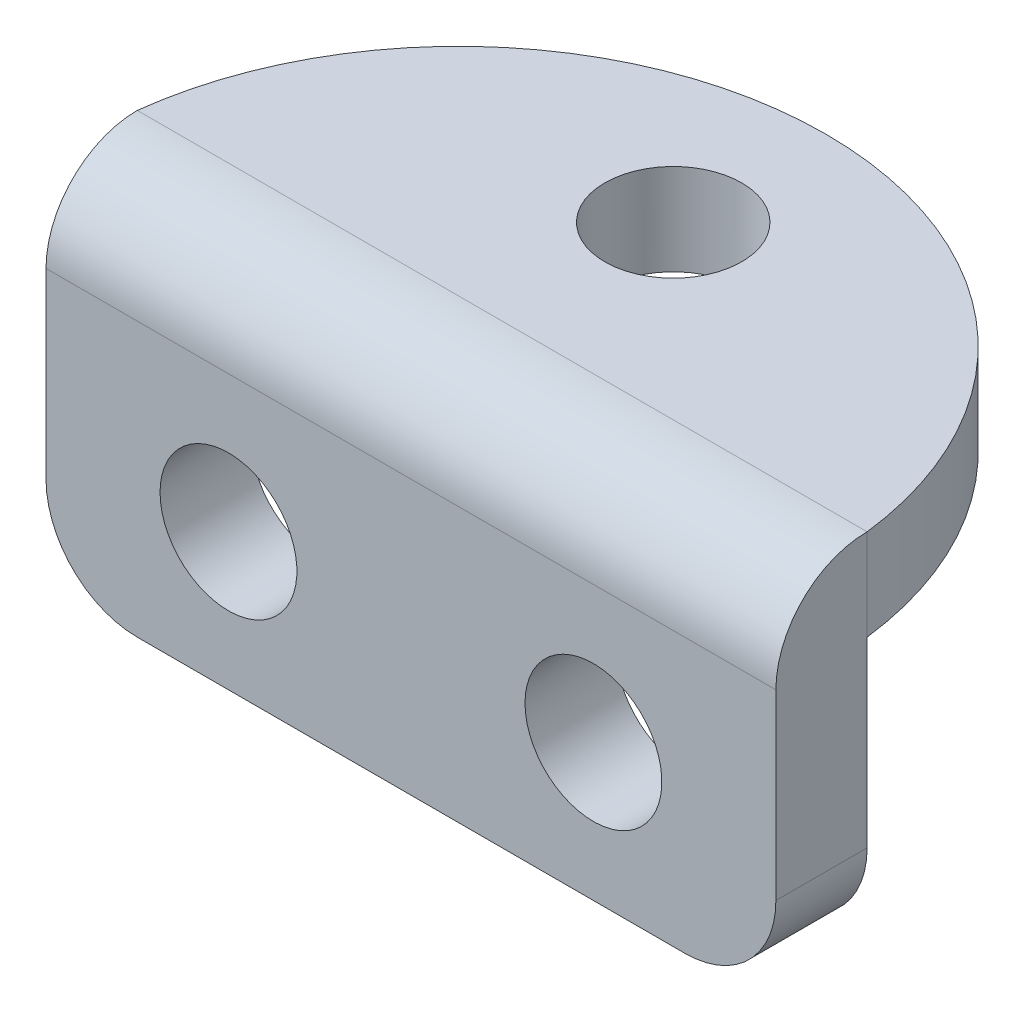
ISO-10303-21;
HEADER;
FILE_DESCRIPTION(('STEP AP214'),'2;1');
FILE_NAME('part.step','',(''),(''),'','','');
FILE_SCHEMA(('AUTOMOTIVE_DESIGN { 1 0 10303 214 1 1 1 1 }'));
ENDSEC;
DATA;
#1=APPLICATION_CONTEXT('core data for automotive mechanical design processes');
#2=APPLICATION_PROTOCOL_DEFINITION('international standard','automotive_design',2000,#1);
#3=PRODUCT_CONTEXT('',#1,'mechanical');
#4=PRODUCT('Part','Part','',(#3));
#5=PRODUCT_RELATED_PRODUCT_CATEGORY('part','',(#4));
#6=PRODUCT_DEFINITION_FORMATION('','',#4);
#7=PRODUCT_DEFINITION_CONTEXT('part definition',#1,'design');
#8=PRODUCT_DEFINITION('design','',#6,#7);
#9=PRODUCT_DEFINITION_SHAPE('','',#8);
#10=(LENGTH_UNIT() NAMED_UNIT(*) SI_UNIT(.MILLI.,.METRE.));
#11=(NAMED_UNIT(*) PLANE_ANGLE_UNIT() SI_UNIT($,.RADIAN.));
#12=(NAMED_UNIT(*) SI_UNIT($,.STERADIAN.) SOLID_ANGLE_UNIT());
#13=UNCERTAINTY_MEASURE_WITH_UNIT(LENGTH_MEASURE(1.E-05),#10,'distance_accuracy_value','');
#14=(GEOMETRIC_REPRESENTATION_CONTEXT(3) GLOBAL_UNCERTAINTY_ASSIGNED_CONTEXT((#13)) GLOBAL_UNIT_ASSIGNED_CONTEXT((#10,
#11,#12)) REPRESENTATION_CONTEXT('',''));
#15=CARTESIAN_POINT('',(0.,0.,0.));
#16=DIRECTION('',(0.,0.,1.));
#17=DIRECTION('',(1.,0.,0.));
#18=AXIS2_PLACEMENT_3D('',#15,#16,#17);
#19=CARTESIAN_POINT('',(8.,2.,0.959848869791568));
#20=DIRECTION('',(0.,-1.,0.));
#21=DIRECTION('',(1.,0.,0.));
#22=AXIS2_PLACEMENT_3D('',#19,#20,#21);
#23=CYLINDRICAL_SURFACE('',#22,8.05737611464428);
#24=CARTESIAN_POINT('',(8.,0.,0.959848869791568));
#25=DIRECTION('',(0.,1.,0.));
#26=DIRECTION('',(1.,0.,0.));
#27=AXIS2_PLACEMENT_3D('',#24,#25,#26);
#28=CIRCLE('',#27,8.05737611464428);
#29=CARTESIAN_POINT('',(16.,0.,0.));
#30=VERTEX_POINT('',#29);
#31=CARTESIAN_POINT('',(0.,0.,0.));
#32=VERTEX_POINT('',#31);
#33=EDGE_CURVE('E77',#30,#32,#28,.T.);
#34=ORIENTED_EDGE('',*,*,#33,.T.);
#35=DIRECTION('',(0.,-1.,0.));
#36=VECTOR('',#35,1.);
#37=CARTESIAN_POINT('',(0.,2.,0.));
#38=LINE('',#37,#36);
#39=CARTESIAN_POINT('',(0.,2.,0.));
#40=VERTEX_POINT('',#39);
#41=EDGE_CURVE('E12',#40,#32,#38,.T.);
#42=ORIENTED_EDGE('',*,*,#41,.F.);
#43=CARTESIAN_POINT('',(8.,2.,0.959848869791568));
#44=DIRECTION('',(0.,1.,0.));
#45=DIRECTION('',(1.,0.,0.));
#46=AXIS2_PLACEMENT_3D('',#43,#44,#45);
#47=CIRCLE('',#46,8.05737611464428);
#48=CARTESIAN_POINT('',(16.,2.,0.));
#49=VERTEX_POINT('',#48);
#50=EDGE_CURVE('E76',#49,#40,#47,.T.);
#51=ORIENTED_EDGE('',*,*,#50,.F.);
#52=DIRECTION('',(0.,-1.,0.));
#53=VECTOR('',#52,1.);
#54=CARTESIAN_POINT('',(16.,2.,0.));
#55=LINE('',#54,#53);
#56=EDGE_CURVE('E54',#49,#30,#55,.T.);
#57=ORIENTED_EDGE('',*,*,#56,.T.);
#58=EDGE_LOOP('',(#34,#42,#51,#57));
#59=FACE_BOUND('',#58,.T.);
#60=ADVANCED_FACE('F45',(#59),#23,.T.);
#61=CARTESIAN_POINT('',(0.,2.,0.));
#62=DIRECTION('',(0.,0.,-1.));
#63=DIRECTION('',(-1.,0.,0.));
#64=AXIS2_PLACEMENT_3D('',#61,#62,#63);
#65=PLANE('',#64);
#66=DIRECTION('',(1.,0.,0.));
#67=VECTOR('',#66,1.);
#68=CARTESIAN_POINT('',(0.,0.,0.));
#69=LINE('',#68,#67);
#70=EDGE_CURVE('E69',#32,#30,#69,.T.);
#71=ORIENTED_EDGE('',*,*,#70,.T.);
#72=ORIENTED_EDGE('',*,*,#56,.F.);
#73=DIRECTION('',(1.,0.,0.));
#74=VECTOR('',#73,1.);
#75=CARTESIAN_POINT('',(0.,2.,0.));
#76=LINE('',#75,#74);
#77=EDGE_CURVE('E61',#40,#49,#76,.T.);
#78=ORIENTED_EDGE('',*,*,#77,.F.);
#79=ORIENTED_EDGE('',*,*,#41,.T.);
#80=EDGE_LOOP('',(#71,#72,#78,#79));
#81=FACE_BOUND('',#80,.T.);
#82=ADVANCED_FACE('F72',(#81),#65,.F.);
#83=CARTESIAN_POINT('',(8.,2.,0.959848869791568));
#84=DIRECTION('',(0.,-1.,0.));
#85=DIRECTION('',(1.,0.,0.));
#86=AXIS2_PLACEMENT_3D('',#83,#84,#85);
#87=PLANE('',#86);
#88=CARTESIAN_POINT('',(8.,2.,-3.75));
#89=DIRECTION('',(0.,1.,0.));
#90=DIRECTION('',(-1.,0.,0.));
#91=AXIS2_PLACEMENT_3D('',#88,#89,#90);
#92=CIRCLE('',#91,1.5);
#93=CARTESIAN_POINT('',(6.5,2.,-3.75));
#94=VERTEX_POINT('',#93);
#95=EDGE_CURVE('E84',#94,#94,#92,.T.);
#96=ORIENTED_EDGE('',*,*,#95,.F.);
#97=EDGE_LOOP('',(#96));
#98=FACE_BOUND('',#97,.T.);
#99=ORIENTED_EDGE('',*,*,#50,.T.);
#100=ORIENTED_EDGE('',*,*,#77,.T.);
#101=EDGE_LOOP('',(#99,#100));
#102=FACE_BOUND('',#101,.T.);
#103=ADVANCED_FACE('F93',(#98,#102),#87,.F.);
#104=CARTESIAN_POINT('',(8.,0.,0.959848869791568));
#105=DIRECTION('',(0.,-1.,0.));
#106=DIRECTION('',(1.,0.,0.));
#107=AXIS2_PLACEMENT_3D('',#104,#105,#106);
#108=PLANE('',#107);
#109=CARTESIAN_POINT('',(8.,0.,-3.75));
#110=DIRECTION('',(0.,-1.,0.));
#111=DIRECTION('',(1.,0.,0.));
#112=AXIS2_PLACEMENT_3D('',#109,#110,#111);
#113=CIRCLE('',#112,1.5);
#114=CARTESIAN_POINT('',(9.50000000000001,0.,-3.75));
#115=VERTEX_POINT('',#114);
#116=EDGE_CURVE('E48',#115,#115,#113,.T.);
#117=ORIENTED_EDGE('',*,*,#116,.F.);
#118=EDGE_LOOP('',(#117));
#119=FACE_BOUND('',#118,.T.);
#120=ORIENTED_EDGE('',*,*,#33,.F.);
#121=ORIENTED_EDGE('',*,*,#70,.F.);
#122=EDGE_LOOP('',(#120,#121));
#123=FACE_BOUND('',#122,.T.);
#124=ADVANCED_FACE('F81',(#119,#123),#108,.T.);
#125=CARTESIAN_POINT('',(8.,-2.,-3.75));
#126=DIRECTION('',(0.,1.,0.));
#127=DIRECTION('',(-1.,0.,0.));
#128=AXIS2_PLACEMENT_3D('',#125,#126,#127);
#129=CYLINDRICAL_SURFACE('',#128,1.5);
#130=ORIENTED_EDGE('',*,*,#116,.T.);
#131=EDGE_LOOP('',(#130));
#132=FACE_BOUND('',#131,.T.);
#133=ORIENTED_EDGE('',*,*,#95,.T.);
#134=EDGE_LOOP('',(#133));
#135=FACE_BOUND('',#134,.T.);
#136=ADVANCED_FACE('F91',(#132,#135),#129,.F.);
#137=CLOSED_SHELL('',(#60,#82,#103,#124,#136));
#138=MANIFOLD_SOLID_BREP('B2',#137);
#139=CARTESIAN_POINT('',(0.,0.,2.));
#140=DIRECTION('',(1.,0.,0.));
#141=DIRECTION('',(0.,1.,0.));
#142=AXIS2_PLACEMENT_3D('',#139,#140,#141);
#143=PLANE('',#142);
#144=DIRECTION('',(0.,-1.,0.));
#145=VECTOR('',#144,1.);
#146=CARTESIAN_POINT('',(0.,0.,0.));
#147=LINE('',#146,#145);
#148=CARTESIAN_POINT('',(0.,2.,0.));
#149=VERTEX_POINT('',#148);
#150=CARTESIAN_POINT('',(0.,-4.,0.));
#151=VERTEX_POINT('',#150);
#152=EDGE_CURVE('E215',#149,#151,#147,.T.);
#153=ORIENTED_EDGE('',*,*,#152,.T.);
#154=DIRECTION('',(0.,0.,-1.));
#155=VECTOR('',#154,1.);
#156=CARTESIAN_POINT('',(0.,-4.,2.));
#157=LINE('',#156,#155);
#158=CARTESIAN_POINT('',(0.,-4.,2.));
#159=VERTEX_POINT('',#158);
#160=EDGE_CURVE('E43',#159,#151,#157,.T.);
#161=ORIENTED_EDGE('',*,*,#160,.F.);
#162=DIRECTION('',(0.,-1.,0.));
#163=VECTOR('',#162,1.);
#164=CARTESIAN_POINT('',(0.,0.,2.));
#165=LINE('',#164,#163);
#166=CARTESIAN_POINT('',(0.,0.,2.));
#167=VERTEX_POINT('',#166);
#168=EDGE_CURVE('E188',#167,#159,#165,.T.);
#169=ORIENTED_EDGE('',*,*,#168,.F.);
#170=CARTESIAN_POINT('',(0.,0.,0.));
#171=DIRECTION('',(-1.,0.,0.));
#172=DIRECTION('',(0.,-1.,0.));
#173=AXIS2_PLACEMENT_3D('',#170,#171,#172);
#174=CIRCLE('',#173,2.);
#175=EDGE_CURVE('E242',#167,#149,#174,.T.);
#176=ORIENTED_EDGE('',*,*,#175,.T.);
#177=EDGE_LOOP('',(#153,#161,#169,#176));
#178=FACE_BOUND('',#177,.T.);
#179=ADVANCED_FACE('F138',(#178),#143,.F.);
#180=CARTESIAN_POINT('',(2.,-4.,2.));
#181=DIRECTION('',(0.,0.,-1.));
#182=DIRECTION('',(-1.,0.,0.));
#183=AXIS2_PLACEMENT_3D('',#180,#181,#182);
#184=CYLINDRICAL_SURFACE('',#183,2.);
#185=CARTESIAN_POINT('',(2.,-4.,0.));
#186=DIRECTION('',(0.,0.,1.));
#187=DIRECTION('',(1.,0.,0.));
#188=AXIS2_PLACEMENT_3D('',#185,#186,#187);
#189=CIRCLE('',#188,2.);
#190=CARTESIAN_POINT('',(2.,-6.,0.));
#191=VERTEX_POINT('',#190);
#192=EDGE_CURVE('E217',#151,#191,#189,.T.);
#193=ORIENTED_EDGE('',*,*,#192,.T.);
#194=DIRECTION('',(0.,0.,-1.));
#195=VECTOR('',#194,1.);
#196=CARTESIAN_POINT('',(2.,-6.,2.));
#197=LINE('',#196,#195);
#198=CARTESIAN_POINT('',(2.,-6.,2.));
#199=VERTEX_POINT('',#198);
#200=EDGE_CURVE('E146',#199,#191,#197,.T.);
#201=ORIENTED_EDGE('',*,*,#200,.F.);
#202=CARTESIAN_POINT('',(2.,-4.,2.));
#203=DIRECTION('',(0.,0.,1.));
#204=DIRECTION('',(1.,0.,0.));
#205=AXIS2_PLACEMENT_3D('',#202,#203,#204);
#206=CIRCLE('',#205,2.);
#207=EDGE_CURVE('E203',#159,#199,#206,.T.);
#208=ORIENTED_EDGE('',*,*,#207,.F.);
#209=ORIENTED_EDGE('',*,*,#160,.T.);
#210=EDGE_LOOP('',(#193,#201,#208,#209));
#211=FACE_BOUND('',#210,.T.);
#212=ADVANCED_FACE('F253',(#211),#184,.T.);
#213=CARTESIAN_POINT('',(2.,-6.,2.));
#214=DIRECTION('',(0.,1.,0.));
#215=DIRECTION('',(0.,0.,1.));
#216=AXIS2_PLACEMENT_3D('',#213,#214,#215);
#217=PLANE('',#216);
#218=DIRECTION('',(1.,0.,0.));
#219=VECTOR('',#218,1.);
#220=CARTESIAN_POINT('',(2.,-6.,0.));
#221=LINE('',#220,#219);
#222=CARTESIAN_POINT('',(14.,-6.,0.));
#223=VERTEX_POINT('',#222);
#224=EDGE_CURVE('E172',#191,#223,#221,.T.);
#225=ORIENTED_EDGE('',*,*,#224,.T.);
#226=DIRECTION('',(0.,0.,-1.));
#227=VECTOR('',#226,1.);
#228=CARTESIAN_POINT('',(14.,-6.,2.));
#229=LINE('',#228,#227);
#230=CARTESIAN_POINT('',(14.,-6.,2.));
#231=VERTEX_POINT('',#230);
#232=EDGE_CURVE('E206',#231,#223,#229,.T.);
#233=ORIENTED_EDGE('',*,*,#232,.F.);
#234=DIRECTION('',(1.,0.,0.));
#235=VECTOR('',#234,1.);
#236=CARTESIAN_POINT('',(2.,-6.,2.));
#237=LINE('',#236,#235);
#238=EDGE_CURVE('E198',#199,#231,#237,.T.);
#239=ORIENTED_EDGE('',*,*,#238,.F.);
#240=ORIENTED_EDGE('',*,*,#200,.T.);
#241=EDGE_LOOP('',(#225,#233,#239,#240));
#242=FACE_BOUND('',#241,.T.);
#243=ADVANCED_FACE('F207',(#242),#217,.F.);
#244=CARTESIAN_POINT('',(14.,-4.,2.));
#245=DIRECTION('',(0.,0.,-1.));
#246=DIRECTION('',(-1.,0.,0.));
#247=AXIS2_PLACEMENT_3D('',#244,#245,#246);
#248=CYLINDRICAL_SURFACE('',#247,2.);
#249=CARTESIAN_POINT('',(14.,-4.,0.));
#250=DIRECTION('',(0.,0.,1.));
#251=DIRECTION('',(-1.,0.,0.));
#252=AXIS2_PLACEMENT_3D('',#249,#250,#251);
#253=CIRCLE('',#252,2.);
#254=CARTESIAN_POINT('',(16.,-4.,0.));
#255=VERTEX_POINT('',#254);
#256=EDGE_CURVE('E179',#223,#255,#253,.T.);
#257=ORIENTED_EDGE('',*,*,#256,.T.);
#258=DIRECTION('',(0.,0.,-1.));
#259=VECTOR('',#258,1.);
#260=CARTESIAN_POINT('',(16.,-4.,2.));
#261=LINE('',#260,#259);
#262=CARTESIAN_POINT('',(16.,-4.,2.));
#263=VERTEX_POINT('',#262);
#264=EDGE_CURVE('E208',#263,#255,#261,.T.);
#265=ORIENTED_EDGE('',*,*,#264,.F.);
#266=CARTESIAN_POINT('',(14.,-4.,2.));
#267=DIRECTION('',(0.,0.,1.));
#268=DIRECTION('',(-1.,0.,0.));
#269=AXIS2_PLACEMENT_3D('',#266,#267,#268);
#270=CIRCLE('',#269,2.);
#271=EDGE_CURVE('E201',#231,#263,#270,.T.);
#272=ORIENTED_EDGE('',*,*,#271,.F.);
#273=ORIENTED_EDGE('',*,*,#232,.T.);
#274=EDGE_LOOP('',(#257,#265,#272,#273));
#275=FACE_BOUND('',#274,.T.);
#276=ADVANCED_FACE('F210',(#275),#248,.T.);
#277=CARTESIAN_POINT('',(16.,-4.,2.));
#278=DIRECTION('',(-1.,0.,0.));
#279=DIRECTION('',(0.,0.,1.));
#280=AXIS2_PLACEMENT_3D('',#277,#278,#279);
#281=PLANE('',#280);
#282=DIRECTION('',(0.,1.,0.));
#283=VECTOR('',#282,1.);
#284=CARTESIAN_POINT('',(16.,-4.,0.));
#285=LINE('',#284,#283);
#286=CARTESIAN_POINT('',(16.,2.,0.));
#287=VERTEX_POINT('',#286);
#288=EDGE_CURVE('E222',#255,#287,#285,.T.);
#289=ORIENTED_EDGE('',*,*,#288,.T.);
#290=CARTESIAN_POINT('',(16.,0.,0.));
#291=DIRECTION('',(-1.,0.,0.));
#292=DIRECTION('',(0.,-1.,0.));
#293=AXIS2_PLACEMENT_3D('',#290,#291,#292);
#294=CIRCLE('',#293,2.);
#295=CARTESIAN_POINT('',(16.,0.,2.));
#296=VERTEX_POINT('',#295);
#297=EDGE_CURVE('E238',#296,#287,#294,.T.);
#298=ORIENTED_EDGE('',*,*,#297,.F.);
#299=DIRECTION('',(0.,1.,0.));
#300=VECTOR('',#299,1.);
#301=CARTESIAN_POINT('',(16.,-4.,2.));
#302=LINE('',#301,#300);
#303=EDGE_CURVE('E154',#263,#296,#302,.T.);
#304=ORIENTED_EDGE('',*,*,#303,.F.);
#305=ORIENTED_EDGE('',*,*,#264,.T.);
#306=EDGE_LOOP('',(#289,#298,#304,#305));
#307=FACE_BOUND('',#306,.T.);
#308=ADVANCED_FACE('F237',(#307),#281,.F.);
#309=CARTESIAN_POINT('',(2.,-4.,2.));
#310=DIRECTION('',(0.,0.,1.));
#311=DIRECTION('',(1.,0.,0.));
#312=AXIS2_PLACEMENT_3D('',#309,#310,#311);
#313=PLANE('',#312);
#314=CARTESIAN_POINT('',(4.,-3.,2.));
#315=DIRECTION('',(0.,0.,-1.));
#316=DIRECTION('',(-1.,0.,0.));
#317=AXIS2_PLACEMENT_3D('',#314,#315,#316);
#318=CIRCLE('',#317,1.5);
#319=CARTESIAN_POINT('',(2.5,-3.,2.));
#320=VERTEX_POINT('',#319);
#321=EDGE_CURVE('E285',#320,#320,#318,.T.);
#322=ORIENTED_EDGE('',*,*,#321,.T.);
#323=EDGE_LOOP('',(#322));
#324=FACE_BOUND('',#323,.T.);
#325=CARTESIAN_POINT('',(12.,-3.,2.));
#326=DIRECTION('',(0.,0.,-1.));
#327=DIRECTION('',(-1.,0.,0.));
#328=AXIS2_PLACEMENT_3D('',#325,#326,#327);
#329=CIRCLE('',#328,1.5);
#330=CARTESIAN_POINT('',(10.5,-3.,2.));
#331=VERTEX_POINT('',#330);
#332=EDGE_CURVE('E244',#331,#331,#329,.T.);
#333=ORIENTED_EDGE('',*,*,#332,.T.);
#334=EDGE_LOOP('',(#333));
#335=FACE_BOUND('',#334,.T.);
#336=DIRECTION('',(-1.,0.,0.));
#337=VECTOR('',#336,1.);
#338=CARTESIAN_POINT('',(16.,0.,2.));
#339=LINE('',#338,#337);
#340=EDGE_CURVE('E225',#296,#167,#339,.T.);
#341=ORIENTED_EDGE('',*,*,#340,.T.);
#342=ORIENTED_EDGE('',*,*,#168,.T.);
#343=ORIENTED_EDGE('',*,*,#207,.T.);
#344=ORIENTED_EDGE('',*,*,#238,.T.);
#345=ORIENTED_EDGE('',*,*,#271,.T.);
#346=ORIENTED_EDGE('',*,*,#303,.T.);
#347=EDGE_LOOP('',(#341,#342,#343,#344,#345,#346));
#348=FACE_BOUND('',#347,.T.);
#349=ADVANCED_FACE('F199',(#324,#335,#348),#313,.T.);
#350=CARTESIAN_POINT('',(2.,-4.,0.));
#351=DIRECTION('',(0.,0.,1.));
#352=DIRECTION('',(1.,0.,0.));
#353=AXIS2_PLACEMENT_3D('',#350,#351,#352);
#354=PLANE('',#353);
#355=CARTESIAN_POINT('',(4.,-3.,0.));
#356=DIRECTION('',(0.,0.,-1.));
#357=DIRECTION('',(-1.,0.,0.));
#358=AXIS2_PLACEMENT_3D('',#355,#356,#357);
#359=CIRCLE('',#358,1.5);
#360=CARTESIAN_POINT('',(2.5,-3.,0.));
#361=VERTEX_POINT('',#360);
#362=EDGE_CURVE('E288',#361,#361,#359,.T.);
#363=ORIENTED_EDGE('',*,*,#362,.F.);
#364=EDGE_LOOP('',(#363));
#365=FACE_BOUND('',#364,.T.);
#366=CARTESIAN_POINT('',(12.,-3.,0.));
#367=DIRECTION('',(0.,0.,-1.));
#368=DIRECTION('',(-1.,0.,0.));
#369=AXIS2_PLACEMENT_3D('',#366,#367,#368);
#370=CIRCLE('',#369,1.5);
#371=CARTESIAN_POINT('',(10.5,-3.,0.));
#372=VERTEX_POINT('',#371);
#373=EDGE_CURVE('E248',#372,#372,#370,.T.);
#374=ORIENTED_EDGE('',*,*,#373,.F.);
#375=EDGE_LOOP('',(#374));
#376=FACE_BOUND('',#375,.T.);
#377=ORIENTED_EDGE('',*,*,#152,.F.);
#378=DIRECTION('',(-1.,0.,0.));
#379=VECTOR('',#378,1.);
#380=CARTESIAN_POINT('',(16.,2.,0.));
#381=LINE('',#380,#379);
#382=EDGE_CURVE('E218',#287,#149,#381,.T.);
#383=ORIENTED_EDGE('',*,*,#382,.F.);
#384=ORIENTED_EDGE('',*,*,#288,.F.);
#385=ORIENTED_EDGE('',*,*,#256,.F.);
#386=ORIENTED_EDGE('',*,*,#224,.F.);
#387=ORIENTED_EDGE('',*,*,#192,.F.);
#388=EDGE_LOOP('',(#377,#383,#384,#385,#386,#387));
#389=FACE_BOUND('',#388,.T.);
#390=ADVANCED_FACE('F230',(#365,#376,#389),#354,.F.);
#391=CARTESIAN_POINT('',(16.,0.,0.));
#392=DIRECTION('',(-1.,0.,0.));
#393=DIRECTION('',(0.,-1.,0.));
#394=AXIS2_PLACEMENT_3D('',#391,#392,#393);
#395=CYLINDRICAL_SURFACE('',#394,2.);
#396=ORIENTED_EDGE('',*,*,#175,.F.);
#397=ORIENTED_EDGE('',*,*,#340,.F.);
#398=ORIENTED_EDGE('',*,*,#297,.T.);
#399=ORIENTED_EDGE('',*,*,#382,.T.);
#400=EDGE_LOOP('',(#396,#397,#398,#399));
#401=FACE_BOUND('',#400,.T.);
#402=ADVANCED_FACE('F241',(#401),#395,.T.);
#403=CARTESIAN_POINT('',(12.,-3.,2.));
#404=DIRECTION('',(0.,0.,-1.));
#405=DIRECTION('',(-1.,0.,0.));
#406=AXIS2_PLACEMENT_3D('',#403,#404,#405);
#407=CYLINDRICAL_SURFACE('',#406,1.5);
#408=ORIENTED_EDGE('',*,*,#332,.F.);
#409=EDGE_LOOP('',(#408));
#410=FACE_BOUND('',#409,.T.);
#411=ORIENTED_EDGE('',*,*,#373,.T.);
#412=EDGE_LOOP('',(#411));
#413=FACE_BOUND('',#412,.T.);
#414=ADVANCED_FACE('F273',(#410,#413),#407,.F.);
#415=CARTESIAN_POINT('',(4.,-3.,2.));
#416=DIRECTION('',(0.,0.,-1.));
#417=DIRECTION('',(-1.,0.,0.));
#418=AXIS2_PLACEMENT_3D('',#415,#416,#417);
#419=CYLINDRICAL_SURFACE('',#418,1.5);
#420=ORIENTED_EDGE('',*,*,#321,.F.);
#421=EDGE_LOOP('',(#420));
#422=FACE_BOUND('',#421,.T.);
#423=ORIENTED_EDGE('',*,*,#362,.T.);
#424=EDGE_LOOP('',(#423));
#425=FACE_BOUND('',#424,.T.);
#426=ADVANCED_FACE('F276',(#422,#425),#419,.F.);
#427=CLOSED_SHELL('',(#179,#212,#243,#276,#308,#349,#390,#402,#414,#426));
#428=MANIFOLD_SOLID_BREP('B6',#427);
#429=ADVANCED_BREP_SHAPE_REPRESENTATION('',(#18,#138,#428),#14);
#430=SHAPE_DEFINITION_REPRESENTATION(#9,#429);
ENDSEC;
END-ISO-10303-21;
